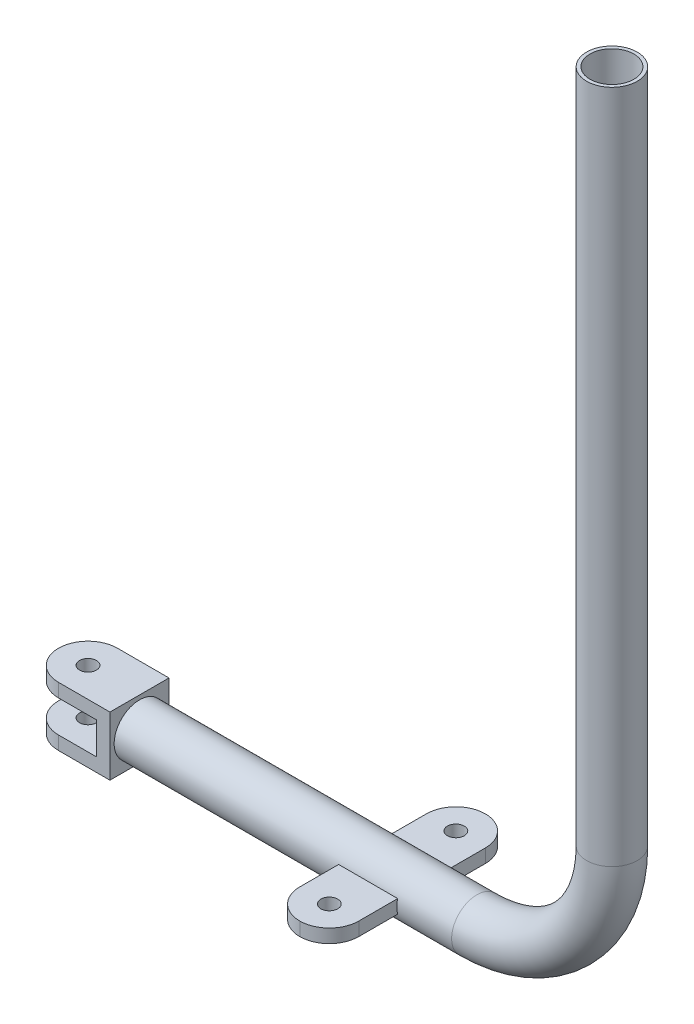
ISO-10303-21;
HEADER;
FILE_DESCRIPTION(('STEP AP214'),'2;1');
FILE_NAME('part.step','',(''),(''),'','','');
FILE_SCHEMA(('AUTOMOTIVE_DESIGN { 1 0 10303 214 1 1 1 1 }'));
ENDSEC;
DATA;
#1=APPLICATION_CONTEXT('core data for automotive mechanical design processes');
#2=APPLICATION_PROTOCOL_DEFINITION('international standard','automotive_design',2000,#1);
#3=PRODUCT_CONTEXT('',#1,'mechanical');
#4=PRODUCT('Part','Part','',(#3));
#5=PRODUCT_RELATED_PRODUCT_CATEGORY('part','',(#4));
#6=PRODUCT_DEFINITION_FORMATION('','',#4);
#7=PRODUCT_DEFINITION_CONTEXT('part definition',#1,'design');
#8=PRODUCT_DEFINITION('design','',#6,#7);
#9=PRODUCT_DEFINITION_SHAPE('','',#8);
#10=(LENGTH_UNIT() NAMED_UNIT(*) SI_UNIT(.MILLI.,.METRE.));
#11=(NAMED_UNIT(*) PLANE_ANGLE_UNIT() SI_UNIT($,.RADIAN.));
#12=(NAMED_UNIT(*) SI_UNIT($,.STERADIAN.) SOLID_ANGLE_UNIT());
#13=UNCERTAINTY_MEASURE_WITH_UNIT(LENGTH_MEASURE(1.E-05),#10,'distance_accuracy_value','');
#14=(GEOMETRIC_REPRESENTATION_CONTEXT(3) GLOBAL_UNCERTAINTY_ASSIGNED_CONTEXT((#13)) GLOBAL_UNIT_ASSIGNED_CONTEXT((#10,
#11,#12)) REPRESENTATION_CONTEXT('',''));
#15=CARTESIAN_POINT('',(0.,0.,0.));
#16=DIRECTION('',(0.,0.,1.));
#17=DIRECTION('',(1.,0.,0.));
#18=AXIS2_PLACEMENT_3D('',#15,#16,#17);
#19=CARTESIAN_POINT('',(0.,0.,0.));
#20=DIRECTION('',(1.,0.,0.));
#21=DIRECTION('',(0.,0.,-1.));
#22=AXIS2_PLACEMENT_3D('',#19,#20,#21);
#23=CYLINDRICAL_SURFACE('',#22,15.);
#24=DIRECTION('',(1.,0.,0.));
#25=VECTOR('',#24,1.);
#26=CARTESIAN_POINT('',(0.,-4.,-14.456832294801));
#27=LINE('',#26,#25);
#28=CARTESIAN_POINT('',(132.5,-3.99999999999999,-14.456832294801));
#29=VERTEX_POINT('',#28);
#30=CARTESIAN_POINT('',(167.5,-3.99999999999999,-14.456832294801));
#31=VERTEX_POINT('',#30);
#32=EDGE_CURVE('E224',#29,#31,#27,.T.);
#33=ORIENTED_EDGE('',*,*,#32,.T.);
#34=CARTESIAN_POINT('',(167.5,0.,0.));
#35=DIRECTION('',(1.,0.,0.));
#36=DIRECTION('',(0.,0.,-1.));
#37=AXIS2_PLACEMENT_3D('',#34,#35,#36);
#38=CIRCLE('',#37,15.);
#39=CARTESIAN_POINT('',(167.5,4.00000000000001,-14.456832294801));
#40=VERTEX_POINT('',#39);
#41=EDGE_CURVE('E208',#31,#40,#38,.T.);
#42=ORIENTED_EDGE('',*,*,#41,.T.);
#43=DIRECTION('',(1.,0.,0.));
#44=VECTOR('',#43,1.);
#45=CARTESIAN_POINT('',(0.,4.00000000000001,-14.456832294801));
#46=LINE('',#45,#44);
#47=CARTESIAN_POINT('',(132.5,4.00000000000001,-14.456832294801));
#48=VERTEX_POINT('',#47);
#49=EDGE_CURVE('E213',#40,#48,#46,.F.);
#50=ORIENTED_EDGE('',*,*,#49,.T.);
#51=CARTESIAN_POINT('',(132.5,0.,0.));
#52=DIRECTION('',(-1.,0.,0.));
#53=DIRECTION('',(0.,0.,1.));
#54=AXIS2_PLACEMENT_3D('',#51,#52,#53);
#55=CIRCLE('',#54,15.);
#56=EDGE_CURVE('E219',#48,#29,#55,.T.);
#57=ORIENTED_EDGE('',*,*,#56,.T.);
#58=EDGE_LOOP('',(#33,#42,#50,#57));
#59=FACE_BOUND('',#58,.T.);
#60=CARTESIAN_POINT('',(0.,0.,0.));
#61=DIRECTION('',(-1.,0.,0.));
#62=DIRECTION('',(0.,0.,-1.));
#63=AXIS2_PLACEMENT_3D('',#60,#61,#62);
#64=CIRCLE('',#63,15.);
#65=CARTESIAN_POINT('',(0.,0.,-15.));
#66=VERTEX_POINT('',#65);
#67=EDGE_CURVE('E321',#66,#66,#64,.T.);
#68=ORIENTED_EDGE('',*,*,#67,.F.);
#69=EDGE_LOOP('',(#68));
#70=FACE_BOUND('',#69,.T.);
#71=CARTESIAN_POINT('',(200.,0.,0.));
#72=DIRECTION('',(-1.,0.,0.));
#73=DIRECTION('',(0.,0.,-1.));
#74=AXIS2_PLACEMENT_3D('',#71,#72,#73);
#75=CIRCLE('',#74,15.);
#76=CARTESIAN_POINT('',(200.,-15.,0.));
#77=VERTEX_POINT('',#76);
#78=EDGE_CURVE('E324',#77,#77,#75,.T.);
#79=ORIENTED_EDGE('',*,*,#78,.T.);
#80=EDGE_LOOP('',(#79));
#81=FACE_BOUND('',#80,.T.);
#82=CARTESIAN_POINT('',(167.5,0.,0.));
#83=DIRECTION('',(-1.,0.,0.));
#84=DIRECTION('',(0.,0.,1.));
#85=AXIS2_PLACEMENT_3D('',#82,#83,#84);
#86=CIRCLE('',#85,15.);
#87=CARTESIAN_POINT('',(167.5,-3.99999999999999,14.456832294801));
#88=VERTEX_POINT('',#87);
#89=CARTESIAN_POINT('',(167.5,4.00000000000001,14.456832294801));
#90=VERTEX_POINT('',#89);
#91=EDGE_CURVE('E254',#88,#90,#86,.T.);
#92=ORIENTED_EDGE('',*,*,#91,.F.);
#93=DIRECTION('',(1.,0.,0.));
#94=VECTOR('',#93,1.);
#95=CARTESIAN_POINT('',(0.,-4.,14.456832294801));
#96=LINE('',#95,#94);
#97=CARTESIAN_POINT('',(132.5,-4.,14.456832294801));
#98=VERTEX_POINT('',#97);
#99=EDGE_CURVE('E245',#98,#88,#96,.T.);
#100=ORIENTED_EDGE('',*,*,#99,.F.);
#101=CARTESIAN_POINT('',(132.5,0.,0.));
#102=DIRECTION('',(1.,0.,0.));
#103=DIRECTION('',(0.,0.,-1.));
#104=AXIS2_PLACEMENT_3D('',#101,#102,#103);
#105=CIRCLE('',#104,15.);
#106=CARTESIAN_POINT('',(132.5,4.00000000000001,14.456832294801));
#107=VERTEX_POINT('',#106);
#108=EDGE_CURVE('E248',#107,#98,#105,.T.);
#109=ORIENTED_EDGE('',*,*,#108,.F.);
#110=DIRECTION('',(1.,0.,0.));
#111=VECTOR('',#110,1.);
#112=CARTESIAN_POINT('',(0.,4.00000000000001,14.456832294801));
#113=LINE('',#112,#111);
#114=EDGE_CURVE('E251',#90,#107,#113,.F.);
#115=ORIENTED_EDGE('',*,*,#114,.F.);
#116=EDGE_LOOP('',(#92,#100,#109,#115));
#117=FACE_BOUND('',#116,.T.);
#118=ADVANCED_FACE('F45',(#59,#70,#81,#117),#23,.T.);
#119=CARTESIAN_POINT('',(0.,0.,0.));
#120=DIRECTION('',(1.,0.,0.));
#121=DIRECTION('',(0.,0.,-1.));
#122=AXIS2_PLACEMENT_3D('',#119,#120,#121);
#123=CYLINDRICAL_SURFACE('',#122,13.);
#124=CARTESIAN_POINT('',(167.5,0.,0.));
#125=DIRECTION('',(1.,0.,0.));
#126=DIRECTION('',(0.,0.,-1.));
#127=AXIS2_PLACEMENT_3D('',#124,#125,#126);
#128=CIRCLE('',#127,13.);
#129=CARTESIAN_POINT('',(167.5,-4.,-12.369316876853));
#130=VERTEX_POINT('',#129);
#131=CARTESIAN_POINT('',(167.5,4.00000000000001,-12.369316876853));
#132=VERTEX_POINT('',#131);
#133=EDGE_CURVE('E404',#130,#132,#128,.T.);
#134=ORIENTED_EDGE('',*,*,#133,.F.);
#135=DIRECTION('',(1.,0.,0.));
#136=VECTOR('',#135,1.);
#137=CARTESIAN_POINT('',(0.,-4.,-12.369316876853));
#138=LINE('',#137,#136);
#139=CARTESIAN_POINT('',(132.5,-3.99999999999999,-12.369316876853));
#140=VERTEX_POINT('',#139);
#141=EDGE_CURVE('E401',#140,#130,#138,.T.);
#142=ORIENTED_EDGE('',*,*,#141,.F.);
#143=CARTESIAN_POINT('',(132.5,0.,0.));
#144=DIRECTION('',(-1.,0.,0.));
#145=DIRECTION('',(0.,0.,1.));
#146=AXIS2_PLACEMENT_3D('',#143,#144,#145);
#147=CIRCLE('',#146,13.);
#148=CARTESIAN_POINT('',(132.5,4.00000000000001,-12.369316876853));
#149=VERTEX_POINT('',#148);
#150=EDGE_CURVE('E398',#149,#140,#147,.T.);
#151=ORIENTED_EDGE('',*,*,#150,.F.);
#152=DIRECTION('',(1.,0.,0.));
#153=VECTOR('',#152,1.);
#154=CARTESIAN_POINT('',(0.,4.00000000000001,-12.369316876853));
#155=LINE('',#154,#153);
#156=EDGE_CURVE('E390',#132,#149,#155,.F.);
#157=ORIENTED_EDGE('',*,*,#156,.F.);
#158=EDGE_LOOP('',(#134,#142,#151,#157));
#159=FACE_BOUND('',#158,.T.);
#160=CARTESIAN_POINT('',(200.,0.,0.));
#161=DIRECTION('',(1.,0.,0.));
#162=DIRECTION('',(0.,0.,-1.));
#163=AXIS2_PLACEMENT_3D('',#160,#161,#162);
#164=CIRCLE('',#163,13.);
#165=CARTESIAN_POINT('',(200.,-13.,0.));
#166=VERTEX_POINT('',#165);
#167=EDGE_CURVE('E310',#166,#166,#164,.F.);
#168=ORIENTED_EDGE('',*,*,#167,.F.);
#169=EDGE_LOOP('',(#168));
#170=FACE_BOUND('',#169,.T.);
#171=CARTESIAN_POINT('',(0.,0.,0.));
#172=DIRECTION('',(-1.,0.,0.));
#173=DIRECTION('',(0.,0.,1.));
#174=AXIS2_PLACEMENT_3D('',#171,#172,#173);
#175=CIRCLE('',#174,13.);
#176=CARTESIAN_POINT('',(0.,0.,13.));
#177=VERTEX_POINT('',#176);
#178=EDGE_CURVE('E309',#177,#177,#175,.T.);
#179=ORIENTED_EDGE('',*,*,#178,.T.);
#180=EDGE_LOOP('',(#179));
#181=FACE_BOUND('',#180,.T.);
#182=DIRECTION('',(1.,0.,0.));
#183=VECTOR('',#182,1.);
#184=CARTESIAN_POINT('',(0.,-4.,12.369316876853));
#185=LINE('',#184,#183);
#186=CARTESIAN_POINT('',(132.5,-3.99999999999999,12.369316876853));
#187=VERTEX_POINT('',#186);
#188=CARTESIAN_POINT('',(167.5,-4.,12.369316876853));
#189=VERTEX_POINT('',#188);
#190=EDGE_CURVE('E359',#187,#189,#185,.T.);
#191=ORIENTED_EDGE('',*,*,#190,.T.);
#192=CARTESIAN_POINT('',(167.5,0.,0.));
#193=DIRECTION('',(-1.,0.,0.));
#194=DIRECTION('',(0.,0.,1.));
#195=AXIS2_PLACEMENT_3D('',#192,#193,#194);
#196=CIRCLE('',#195,13.);
#197=CARTESIAN_POINT('',(167.5,4.00000000000001,12.369316876853));
#198=VERTEX_POINT('',#197);
#199=EDGE_CURVE('E374',#189,#198,#196,.T.);
#200=ORIENTED_EDGE('',*,*,#199,.T.);
#201=DIRECTION('',(1.,0.,0.));
#202=VECTOR('',#201,1.);
#203=CARTESIAN_POINT('',(0.,4.00000000000001,12.369316876853));
#204=LINE('',#203,#202);
#205=CARTESIAN_POINT('',(132.5,4.00000000000001,12.369316876853));
#206=VERTEX_POINT('',#205);
#207=EDGE_CURVE('E371',#198,#206,#204,.F.);
#208=ORIENTED_EDGE('',*,*,#207,.T.);
#209=CARTESIAN_POINT('',(132.5,0.,0.));
#210=DIRECTION('',(1.,0.,0.));
#211=DIRECTION('',(0.,0.,-1.));
#212=AXIS2_PLACEMENT_3D('',#209,#210,#211);
#213=CIRCLE('',#212,13.);
#214=EDGE_CURVE('E368',#206,#187,#213,.T.);
#215=ORIENTED_EDGE('',*,*,#214,.T.);
#216=EDGE_LOOP('',(#191,#200,#208,#215));
#217=FACE_BOUND('',#216,.T.);
#218=ADVANCED_FACE('F451',(#159,#170,#181,#217),#123,.F.);
#219=CARTESIAN_POINT('',(-8.,0.,0.));
#220=DIRECTION('',(1.,0.,0.));
#221=DIRECTION('',(0.,0.,-1.));
#222=AXIS2_PLACEMENT_3D('',#219,#220,#221);
#223=PLANE('',#222);
#224=DIRECTION('',(0.,0.,-1.));
#225=VECTOR('',#224,1.);
#226=CARTESIAN_POINT('',(-8.,-9.50000000000001,17.5));
#227=LINE('',#226,#225);
#228=CARTESIAN_POINT('',(-8.,-9.50000000000001,17.5));
#229=VERTEX_POINT('',#228);
#230=CARTESIAN_POINT('',(-8.,-9.5,-17.5));
#231=VERTEX_POINT('',#230);
#232=EDGE_CURVE('E268',#229,#231,#227,.T.);
#233=ORIENTED_EDGE('',*,*,#232,.F.);
#234=DIRECTION('',(0.,1.,0.));
#235=VECTOR('',#234,1.);
#236=CARTESIAN_POINT('',(-8.,-17.5,17.5));
#237=LINE('',#236,#235);
#238=CARTESIAN_POINT('',(-8.,9.50000000000001,17.5));
#239=VERTEX_POINT('',#238);
#240=EDGE_CURVE('E284',#229,#239,#237,.T.);
#241=ORIENTED_EDGE('',*,*,#240,.T.);
#242=DIRECTION('',(0.,0.,1.));
#243=VECTOR('',#242,1.);
#244=CARTESIAN_POINT('',(-8.,9.50000000000001,17.5));
#245=LINE('',#244,#243);
#246=CARTESIAN_POINT('',(-8.,9.50000000000001,-17.5));
#247=VERTEX_POINT('',#246);
#248=EDGE_CURVE('E276',#247,#239,#245,.T.);
#249=ORIENTED_EDGE('',*,*,#248,.F.);
#250=DIRECTION('',(0.,-1.,0.));
#251=VECTOR('',#250,1.);
#252=CARTESIAN_POINT('',(-8.,-17.5,-17.5));
#253=LINE('',#252,#251);
#254=EDGE_CURVE('E287',#247,#231,#253,.T.);
#255=ORIENTED_EDGE('',*,*,#254,.T.);
#256=EDGE_LOOP('',(#233,#241,#249,#255));
#257=FACE_BOUND('',#256,.T.);
#258=ADVANCED_FACE('F456',(#257),#223,.F.);
#259=CARTESIAN_POINT('',(280.,480.,0.));
#260=DIRECTION('',(0.,-1.,0.));
#261=DIRECTION('',(0.,0.,-1.));
#262=AXIS2_PLACEMENT_3D('',#259,#260,#261);
#263=PLANE('',#262);
#264=CARTESIAN_POINT('',(280.,480.,0.));
#265=DIRECTION('',(0.,-1.,0.));
#266=DIRECTION('',(0.,0.,-1.));
#267=AXIS2_PLACEMENT_3D('',#264,#265,#266);
#268=CIRCLE('',#267,13.);
#269=CARTESIAN_POINT('',(280.,480.,-13.));
#270=VERTEX_POINT('',#269);
#271=EDGE_CURVE('E316',#270,#270,#268,.T.);
#272=ORIENTED_EDGE('',*,*,#271,.T.);
#273=EDGE_LOOP('',(#272));
#274=FACE_BOUND('',#273,.T.);
#275=CARTESIAN_POINT('',(280.,480.,0.));
#276=DIRECTION('',(0.,-1.,0.));
#277=DIRECTION('',(0.,0.,-1.));
#278=AXIS2_PLACEMENT_3D('',#275,#276,#277);
#279=CIRCLE('',#278,15.);
#280=CARTESIAN_POINT('',(280.,480.,-15.));
#281=VERTEX_POINT('',#280);
#282=EDGE_CURVE('E330',#281,#281,#279,.T.);
#283=ORIENTED_EDGE('',*,*,#282,.F.);
#284=EDGE_LOOP('',(#283));
#285=FACE_BOUND('',#284,.T.);
#286=ADVANCED_FACE('F467',(#274,#285),#263,.F.);
#287=CARTESIAN_POINT('',(200.,80.,0.));
#288=DIRECTION('',(0.,0.,1.));
#289=DIRECTION('',(1.,0.,0.));
#290=AXIS2_PLACEMENT_3D('',#287,#288,#289);
#291=TOROIDAL_SURFACE('',#290,80.,15.);
#292=CARTESIAN_POINT('',(280.,80.,0.));
#293=DIRECTION('',(0.,-1.,0.));
#294=DIRECTION('',(0.,0.,-1.));
#295=AXIS2_PLACEMENT_3D('',#292,#293,#294);
#296=CIRCLE('',#295,15.);
#297=CARTESIAN_POINT('',(295.,80.,0.));
#298=VERTEX_POINT('',#297);
#299=EDGE_CURVE('E327',#298,#298,#296,.T.);
#300=CARTESIAN_POINT('',(200.,80.,0.));
#301=DIRECTION('',(0.,0.,1.));
#302=DIRECTION('',(1.,0.,0.));
#303=AXIS2_PLACEMENT_3D('',#300,#301,#302);
#304=CIRCLE('',#303,95.);
#305=EDGE_CURVE('',#77,#298,#304,.T.);
#306=ORIENTED_EDGE('',*,*,#78,.F.);
#307=ORIENTED_EDGE('',*,*,#299,.T.);
#308=ORIENTED_EDGE('',*,*,#305,.T.);
#309=ORIENTED_EDGE('',*,*,#305,.F.);
#310=EDGE_LOOP('',(#306,#308,#307,#309));
#311=FACE_BOUND('',#310,.T.);
#312=ADVANCED_FACE('F463',(#311),#291,.T.);
#313=CARTESIAN_POINT('',(280.,80.,0.));
#314=DIRECTION('',(0.,1.,0.));
#315=DIRECTION('',(0.,0.,1.));
#316=AXIS2_PLACEMENT_3D('',#313,#314,#315);
#317=CYLINDRICAL_SURFACE('',#316,15.);
#318=ORIENTED_EDGE('',*,*,#282,.T.);
#319=EDGE_LOOP('',(#318));
#320=FACE_BOUND('',#319,.T.);
#321=ORIENTED_EDGE('',*,*,#299,.F.);
#322=EDGE_LOOP('',(#321));
#323=FACE_BOUND('',#322,.T.);
#324=ADVANCED_FACE('F466',(#320,#323),#317,.T.);
#325=CARTESIAN_POINT('',(200.,80.,0.));
#326=DIRECTION('',(0.,0.,1.));
#327=DIRECTION('',(1.,0.,0.));
#328=AXIS2_PLACEMENT_3D('',#325,#326,#327);
#329=TOROIDAL_SURFACE('',#328,80.,13.);
#330=CARTESIAN_POINT('',(280.,80.,0.));
#331=DIRECTION('',(0.,-1.,0.));
#332=DIRECTION('',(1.,0.,0.));
#333=AXIS2_PLACEMENT_3D('',#330,#331,#332);
#334=CIRCLE('',#333,13.);
#335=CARTESIAN_POINT('',(293.,80.,0.));
#336=VERTEX_POINT('',#335);
#337=EDGE_CURVE('E313',#336,#336,#334,.T.);
#338=CARTESIAN_POINT('',(200.,80.,0.));
#339=DIRECTION('',(0.,0.,1.));
#340=DIRECTION('',(1.,0.,0.));
#341=AXIS2_PLACEMENT_3D('',#338,#339,#340);
#342=CIRCLE('',#341,93.);
#343=EDGE_CURVE('',#166,#336,#342,.T.);
#344=ORIENTED_EDGE('',*,*,#167,.T.);
#345=ORIENTED_EDGE('',*,*,#337,.F.);
#346=ORIENTED_EDGE('',*,*,#343,.T.);
#347=ORIENTED_EDGE('',*,*,#343,.F.);
#348=EDGE_LOOP('',(#344,#346,#345,#347));
#349=FACE_BOUND('',#348,.T.);
#350=ADVANCED_FACE('F471',(#349),#329,.F.);
#351=CARTESIAN_POINT('',(280.,80.,0.));
#352=DIRECTION('',(0.,1.,0.));
#353=DIRECTION('',(0.,0.,1.));
#354=AXIS2_PLACEMENT_3D('',#351,#352,#353);
#355=CYLINDRICAL_SURFACE('',#354,13.);
#356=ORIENTED_EDGE('',*,*,#271,.F.);
#357=EDGE_LOOP('',(#356));
#358=FACE_BOUND('',#357,.T.);
#359=ORIENTED_EDGE('',*,*,#337,.T.);
#360=EDGE_LOOP('',(#359));
#361=FACE_BOUND('',#360,.T.);
#362=ADVANCED_FACE('F461',(#358,#361),#355,.F.);
#363=CARTESIAN_POINT('',(0.,0.,0.));
#364=DIRECTION('',(1.,0.,0.));
#365=DIRECTION('',(0.,0.,-1.));
#366=AXIS2_PLACEMENT_3D('',#363,#364,#365);
#367=PLANE('',#366);
#368=ORIENTED_EDGE('',*,*,#67,.T.);
#369=EDGE_LOOP('',(#368));
#370=FACE_BOUND('',#369,.T.);
#371=DIRECTION('',(0.,1.,0.));
#372=VECTOR('',#371,1.);
#373=CARTESIAN_POINT('',(0.,-17.5,17.5));
#374=LINE('',#373,#372);
#375=CARTESIAN_POINT('',(0.,-17.5,17.5));
#376=VERTEX_POINT('',#375);
#377=CARTESIAN_POINT('',(0.,17.5,17.5));
#378=VERTEX_POINT('',#377);
#379=EDGE_CURVE('E283',#376,#378,#374,.T.);
#380=ORIENTED_EDGE('',*,*,#379,.F.);
#381=DIRECTION('',(0.,0.,1.));
#382=VECTOR('',#381,1.);
#383=CARTESIAN_POINT('',(0.,-17.5,-17.5));
#384=LINE('',#383,#382);
#385=CARTESIAN_POINT('',(0.,-17.5,-17.5));
#386=VERTEX_POINT('',#385);
#387=EDGE_CURVE('E288',#386,#376,#384,.T.);
#388=ORIENTED_EDGE('',*,*,#387,.F.);
#389=DIRECTION('',(0.,-1.,0.));
#390=VECTOR('',#389,1.);
#391=CARTESIAN_POINT('',(0.,-17.5,-17.5));
#392=LINE('',#391,#390);
#393=CARTESIAN_POINT('',(0.,17.5,-17.5));
#394=VERTEX_POINT('',#393);
#395=EDGE_CURVE('E297',#394,#386,#392,.T.);
#396=ORIENTED_EDGE('',*,*,#395,.F.);
#397=DIRECTION('',(0.,0.,-1.));
#398=VECTOR('',#397,1.);
#399=CARTESIAN_POINT('',(0.,17.5,-17.5));
#400=LINE('',#399,#398);
#401=EDGE_CURVE('E294',#378,#394,#400,.T.);
#402=ORIENTED_EDGE('',*,*,#401,.F.);
#403=EDGE_LOOP('',(#380,#388,#396,#402));
#404=FACE_BOUND('',#403,.T.);
#405=ADVANCED_FACE('F571',(#370,#404),#367,.T.);
#406=CARTESIAN_POINT('',(-8.,-17.5,-17.5));
#407=DIRECTION('',(0.,1.,0.));
#408=DIRECTION('',(0.,0.,1.));
#409=AXIS2_PLACEMENT_3D('',#406,#407,#408);
#410=PLANE('',#409);
#411=CARTESIAN_POINT('',(-30.5,-17.5,0.));
#412=DIRECTION('',(0.,1.,0.));
#413=DIRECTION('',(0.,0.,1.));
#414=AXIS2_PLACEMENT_3D('',#411,#412,#413);
#415=CIRCLE('',#414,5.);
#416=CARTESIAN_POINT('',(-30.5,-17.5,5.));
#417=VERTEX_POINT('',#416);
#418=EDGE_CURVE('E258',#417,#417,#415,.T.);
#419=ORIENTED_EDGE('',*,*,#418,.T.);
#420=EDGE_LOOP('',(#419));
#421=FACE_BOUND('',#420,.T.);
#422=DIRECTION('',(1.,0.,0.));
#423=VECTOR('',#422,1.);
#424=CARTESIAN_POINT('',(-8.,-17.5,17.5));
#425=LINE('',#424,#423);
#426=CARTESIAN_POINT('',(-30.5,-17.5,17.5));
#427=VERTEX_POINT('',#426);
#428=EDGE_CURVE('E291',#427,#376,#425,.T.);
#429=ORIENTED_EDGE('',*,*,#428,.F.);
#430=CARTESIAN_POINT('',(-30.5,-17.5,0.));
#431=DIRECTION('',(0.,1.,0.));
#432=DIRECTION('',(0.,0.,1.));
#433=AXIS2_PLACEMENT_3D('',#430,#431,#432);
#434=CIRCLE('',#433,17.5);
#435=CARTESIAN_POINT('',(-48.,-17.5,0.));
#436=VERTEX_POINT('',#435);
#437=EDGE_CURVE('E345',#427,#436,#434,.F.);
#438=ORIENTED_EDGE('',*,*,#437,.T.);
#439=CARTESIAN_POINT('',(-30.5,-17.5,0.));
#440=DIRECTION('',(0.,1.,0.));
#441=DIRECTION('',(0.,0.,1.));
#442=AXIS2_PLACEMENT_3D('',#439,#440,#441);
#443=CIRCLE('',#442,17.5);
#444=CARTESIAN_POINT('',(-30.5,-17.5,-17.5));
#445=VERTEX_POINT('',#444);
#446=EDGE_CURVE('E343',#436,#445,#443,.F.);
#447=ORIENTED_EDGE('',*,*,#446,.T.);
#448=DIRECTION('',(1.,0.,0.));
#449=VECTOR('',#448,1.);
#450=CARTESIAN_POINT('',(-8.,-17.5,-17.5));
#451=LINE('',#450,#449);
#452=EDGE_CURVE('E303',#445,#386,#451,.T.);
#453=ORIENTED_EDGE('',*,*,#452,.T.);
#454=ORIENTED_EDGE('',*,*,#387,.T.);
#455=EDGE_LOOP('',(#429,#438,#447,#453,#454));
#456=FACE_BOUND('',#455,.T.);
#457=ADVANCED_FACE('F584',(#421,#456),#410,.F.);
#458=CARTESIAN_POINT('',(-8.,-17.5,-17.5));
#459=DIRECTION('',(0.,0.,1.));
#460=DIRECTION('',(1.,0.,0.));
#461=AXIS2_PLACEMENT_3D('',#458,#459,#460);
#462=PLANE('',#461);
#463=ORIENTED_EDGE('',*,*,#452,.F.);
#464=DIRECTION('',(0.,-1.,0.));
#465=VECTOR('',#464,1.);
#466=CARTESIAN_POINT('',(-30.5,-9.5,-17.5));
#467=LINE('',#466,#465);
#468=CARTESIAN_POINT('',(-30.5,-9.5,-17.5));
#469=VERTEX_POINT('',#468);
#470=EDGE_CURVE('E349',#445,#469,#467,.F.);
#471=ORIENTED_EDGE('',*,*,#470,.T.);
#472=DIRECTION('',(1.,0.,0.));
#473=VECTOR('',#472,1.);
#474=CARTESIAN_POINT('',(-48.,-9.5,-17.5));
#475=LINE('',#474,#473);
#476=EDGE_CURVE('E271',#469,#231,#475,.T.);
#477=ORIENTED_EDGE('',*,*,#476,.T.);
#478=ORIENTED_EDGE('',*,*,#254,.F.);
#479=DIRECTION('',(1.,0.,0.));
#480=VECTOR('',#479,1.);
#481=CARTESIAN_POINT('',(-48.,9.5,-17.5));
#482=LINE('',#481,#480);
#483=CARTESIAN_POINT('',(-30.5,9.5,-17.5));
#484=VERTEX_POINT('',#483);
#485=EDGE_CURVE('E281',#484,#247,#482,.T.);
#486=ORIENTED_EDGE('',*,*,#485,.F.);
#487=DIRECTION('',(0.,-1.,0.));
#488=VECTOR('',#487,1.);
#489=CARTESIAN_POINT('',(-30.5,-17.5,-17.5));
#490=LINE('',#489,#488);
#491=CARTESIAN_POINT('',(-30.5,17.5,-17.5));
#492=VERTEX_POINT('',#491);
#493=EDGE_CURVE('E347',#484,#492,#490,.F.);
#494=ORIENTED_EDGE('',*,*,#493,.T.);
#495=DIRECTION('',(1.,0.,0.));
#496=VECTOR('',#495,1.);
#497=CARTESIAN_POINT('',(-8.,17.5,-17.5));
#498=LINE('',#497,#496);
#499=EDGE_CURVE('E305',#492,#394,#498,.T.);
#500=ORIENTED_EDGE('',*,*,#499,.T.);
#501=ORIENTED_EDGE('',*,*,#395,.T.);
#502=EDGE_LOOP('',(#463,#471,#477,#478,#486,#494,#500,#501));
#503=FACE_BOUND('',#502,.T.);
#504=ADVANCED_FACE('F590',(#503),#462,.F.);
#505=CARTESIAN_POINT('',(-8.,17.5,-17.5));
#506=DIRECTION('',(0.,-1.,0.));
#507=DIRECTION('',(0.,0.,-1.));
#508=AXIS2_PLACEMENT_3D('',#505,#506,#507);
#509=PLANE('',#508);
#510=CARTESIAN_POINT('',(-30.5,17.5,0.));
#511=DIRECTION('',(0.,1.,0.));
#512=DIRECTION('',(0.,0.,1.));
#513=AXIS2_PLACEMENT_3D('',#510,#511,#512);
#514=CIRCLE('',#513,5.);
#515=CARTESIAN_POINT('',(-30.5,17.5,5.));
#516=VERTEX_POINT('',#515);
#517=EDGE_CURVE('E257',#516,#516,#514,.T.);
#518=ORIENTED_EDGE('',*,*,#517,.F.);
#519=EDGE_LOOP('',(#518));
#520=FACE_BOUND('',#519,.T.);
#521=CARTESIAN_POINT('',(-30.5,17.5,0.));
#522=DIRECTION('',(0.,-1.,0.));
#523=DIRECTION('',(0.,0.,-1.));
#524=AXIS2_PLACEMENT_3D('',#521,#522,#523);
#525=CIRCLE('',#524,17.5);
#526=CARTESIAN_POINT('',(-48.,17.5,0.));
#527=VERTEX_POINT('',#526);
#528=EDGE_CURVE('E351',#492,#527,#525,.F.);
#529=ORIENTED_EDGE('',*,*,#528,.T.);
#530=CARTESIAN_POINT('',(-30.5,17.5,0.));
#531=DIRECTION('',(0.,-1.,0.));
#532=DIRECTION('',(0.,0.,-1.));
#533=AXIS2_PLACEMENT_3D('',#530,#531,#532);
#534=CIRCLE('',#533,17.5);
#535=CARTESIAN_POINT('',(-30.5,17.5,17.5));
#536=VERTEX_POINT('',#535);
#537=EDGE_CURVE('E353',#527,#536,#534,.F.);
#538=ORIENTED_EDGE('',*,*,#537,.T.);
#539=DIRECTION('',(1.,0.,0.));
#540=VECTOR('',#539,1.);
#541=CARTESIAN_POINT('',(-8.,17.5,17.5));
#542=LINE('',#541,#540);
#543=EDGE_CURVE('E307',#536,#378,#542,.T.);
#544=ORIENTED_EDGE('',*,*,#543,.T.);
#545=ORIENTED_EDGE('',*,*,#401,.T.);
#546=ORIENTED_EDGE('',*,*,#499,.F.);
#547=EDGE_LOOP('',(#529,#538,#544,#545,#546));
#548=FACE_BOUND('',#547,.T.);
#549=ADVANCED_FACE('F578',(#520,#548),#509,.F.);
#550=CARTESIAN_POINT('',(-8.,-17.5,17.5));
#551=DIRECTION('',(0.,0.,-1.));
#552=DIRECTION('',(-1.,0.,0.));
#553=AXIS2_PLACEMENT_3D('',#550,#551,#552);
#554=PLANE('',#553);
#555=DIRECTION('',(1.,0.,0.));
#556=VECTOR('',#555,1.);
#557=CARTESIAN_POINT('',(-48.,-9.50000000000001,17.5));
#558=LINE('',#557,#556);
#559=CARTESIAN_POINT('',(-30.5,-9.50000000000001,17.5));
#560=VERTEX_POINT('',#559);
#561=EDGE_CURVE('E274',#560,#229,#558,.T.);
#562=ORIENTED_EDGE('',*,*,#561,.F.);
#563=DIRECTION('',(0.,1.,0.));
#564=VECTOR('',#563,1.);
#565=CARTESIAN_POINT('',(-30.5,-17.5,17.5));
#566=LINE('',#565,#564);
#567=EDGE_CURVE('E340',#560,#427,#566,.F.);
#568=ORIENTED_EDGE('',*,*,#567,.T.);
#569=ORIENTED_EDGE('',*,*,#428,.T.);
#570=ORIENTED_EDGE('',*,*,#379,.T.);
#571=ORIENTED_EDGE('',*,*,#543,.F.);
#572=DIRECTION('',(0.,1.,0.));
#573=VECTOR('',#572,1.);
#574=CARTESIAN_POINT('',(-30.5,-17.5,17.5));
#575=LINE('',#574,#573);
#576=CARTESIAN_POINT('',(-30.5,9.50000000000001,17.5));
#577=VERTEX_POINT('',#576);
#578=EDGE_CURVE('E337',#536,#577,#575,.F.);
#579=ORIENTED_EDGE('',*,*,#578,.T.);
#580=DIRECTION('',(1.,0.,0.));
#581=VECTOR('',#580,1.);
#582=CARTESIAN_POINT('',(-48.,9.50000000000001,17.5));
#583=LINE('',#582,#581);
#584=EDGE_CURVE('E279',#577,#239,#583,.T.);
#585=ORIENTED_EDGE('',*,*,#584,.T.);
#586=ORIENTED_EDGE('',*,*,#240,.F.);
#587=EDGE_LOOP('',(#562,#568,#569,#570,#571,#579,#585,#586));
#588=FACE_BOUND('',#587,.T.);
#589=ADVANCED_FACE('F569',(#588),#554,.F.);
#590=ORIENTED_EDGE('',*,*,#178,.F.);
#591=EDGE_LOOP('',(#590));
#592=FACE_BOUND('',#591,.T.);
#593=ADVANCED_FACE('F566',(#592),#367,.T.);
#594=CARTESIAN_POINT('',(-48.,9.50000000000001,17.5));
#595=DIRECTION('',(0.,1.,0.));
#596=DIRECTION('',(0.,0.,1.));
#597=AXIS2_PLACEMENT_3D('',#594,#595,#596);
#598=PLANE('',#597);
#599=CARTESIAN_POINT('',(-30.5,9.50000000000001,0.));
#600=DIRECTION('',(0.,1.,0.));
#601=DIRECTION('',(0.,0.,1.));
#602=AXIS2_PLACEMENT_3D('',#599,#600,#601);
#603=CIRCLE('',#602,5.);
#604=CARTESIAN_POINT('',(-30.5,9.50000000000001,5.));
#605=VERTEX_POINT('',#604);
#606=EDGE_CURVE('E264',#605,#605,#603,.T.);
#607=ORIENTED_EDGE('',*,*,#606,.T.);
#608=EDGE_LOOP('',(#607));
#609=FACE_BOUND('',#608,.T.);
#610=ORIENTED_EDGE('',*,*,#584,.F.);
#611=CARTESIAN_POINT('',(-30.5,9.5,0.));
#612=DIRECTION('',(0.,1.,0.));
#613=DIRECTION('',(0.,0.,1.));
#614=AXIS2_PLACEMENT_3D('',#611,#612,#613);
#615=CIRCLE('',#614,17.5);
#616=CARTESIAN_POINT('',(-48.,9.5,0.));
#617=VERTEX_POINT('',#616);
#618=EDGE_CURVE('E357',#577,#617,#615,.F.);
#619=ORIENTED_EDGE('',*,*,#618,.T.);
#620=CARTESIAN_POINT('',(-30.5,9.5,0.));
#621=DIRECTION('',(0.,1.,0.));
#622=DIRECTION('',(0.,0.,1.));
#623=AXIS2_PLACEMENT_3D('',#620,#621,#622);
#624=CIRCLE('',#623,17.5);
#625=EDGE_CURVE('E355',#617,#484,#624,.F.);
#626=ORIENTED_EDGE('',*,*,#625,.T.);
#627=ORIENTED_EDGE('',*,*,#485,.T.);
#628=ORIENTED_EDGE('',*,*,#248,.T.);
#629=EDGE_LOOP('',(#610,#619,#626,#627,#628));
#630=FACE_BOUND('',#629,.T.);
#631=ADVANCED_FACE('F568',(#609,#630),#598,.F.);
#632=CARTESIAN_POINT('',(-48.,-9.50000000000001,17.5));
#633=DIRECTION('',(0.,-1.,0.));
#634=DIRECTION('',(0.,0.,-1.));
#635=AXIS2_PLACEMENT_3D('',#632,#633,#634);
#636=PLANE('',#635);
#637=CARTESIAN_POINT('',(-30.5,-9.5,0.));
#638=DIRECTION('',(0.,-1.,0.));
#639=DIRECTION('',(0.,0.,-1.));
#640=AXIS2_PLACEMENT_3D('',#637,#638,#639);
#641=CIRCLE('',#640,5.);
#642=CARTESIAN_POINT('',(-30.5,-9.5,-5.));
#643=VERTEX_POINT('',#642);
#644=EDGE_CURVE('E261',#643,#643,#641,.T.);
#645=ORIENTED_EDGE('',*,*,#644,.T.);
#646=EDGE_LOOP('',(#645));
#647=FACE_BOUND('',#646,.T.);
#648=CARTESIAN_POINT('',(-30.5,-9.5,0.));
#649=DIRECTION('',(0.,-1.,0.));
#650=DIRECTION('',(0.,0.,-1.));
#651=AXIS2_PLACEMENT_3D('',#648,#649,#650);
#652=CIRCLE('',#651,17.5);
#653=CARTESIAN_POINT('',(-48.,-9.5,0.));
#654=VERTEX_POINT('',#653);
#655=EDGE_CURVE('E333',#469,#654,#652,.F.);
#656=ORIENTED_EDGE('',*,*,#655,.T.);
#657=CARTESIAN_POINT('',(-30.5,-9.5,0.));
#658=DIRECTION('',(0.,-1.,0.));
#659=DIRECTION('',(0.,0.,-1.));
#660=AXIS2_PLACEMENT_3D('',#657,#658,#659);
#661=CIRCLE('',#660,17.5);
#662=EDGE_CURVE('E335',#654,#560,#661,.F.);
#663=ORIENTED_EDGE('',*,*,#662,.T.);
#664=ORIENTED_EDGE('',*,*,#561,.T.);
#665=ORIENTED_EDGE('',*,*,#232,.T.);
#666=ORIENTED_EDGE('',*,*,#476,.F.);
#667=EDGE_LOOP('',(#656,#663,#664,#665,#666));
#668=FACE_BOUND('',#667,.T.);
#669=ADVANCED_FACE('F484',(#647,#668),#636,.F.);
#670=CARTESIAN_POINT('',(-30.5,0.,0.));
#671=DIRECTION('',(0.,1.,0.));
#672=DIRECTION('',(0.,0.,1.));
#673=AXIS2_PLACEMENT_3D('',#670,#671,#672);
#674=CYLINDRICAL_SURFACE('',#673,17.5);
#675=ORIENTED_EDGE('',*,*,#470,.F.);
#676=ORIENTED_EDGE('',*,*,#446,.F.);
#677=DIRECTION('',(0.,-1.,0.));
#678=VECTOR('',#677,1.);
#679=CARTESIAN_POINT('',(-48.,-17.5,0.));
#680=LINE('',#679,#678);
#681=EDGE_CURVE('E272',#654,#436,#680,.T.);
#682=ORIENTED_EDGE('',*,*,#681,.F.);
#683=ORIENTED_EDGE('',*,*,#655,.F.);
#684=EDGE_LOOP('',(#675,#676,#682,#683));
#685=FACE_BOUND('',#684,.T.);
#686=ADVANCED_FACE('F480',(#685),#674,.T.);
#687=CARTESIAN_POINT('',(-30.5,0.,0.));
#688=DIRECTION('',(0.,-1.,0.));
#689=DIRECTION('',(0.,0.,-1.));
#690=AXIS2_PLACEMENT_3D('',#687,#688,#689);
#691=CYLINDRICAL_SURFACE('',#690,17.5);
#692=ORIENTED_EDGE('',*,*,#437,.F.);
#693=ORIENTED_EDGE('',*,*,#567,.F.);
#694=ORIENTED_EDGE('',*,*,#662,.F.);
#695=ORIENTED_EDGE('',*,*,#681,.T.);
#696=EDGE_LOOP('',(#692,#693,#694,#695));
#697=FACE_BOUND('',#696,.T.);
#698=ADVANCED_FACE('F476',(#697),#691,.T.);
#699=CARTESIAN_POINT('',(-30.5,0.,0.));
#700=DIRECTION('',(0.,-1.,0.));
#701=DIRECTION('',(0.,0.,-1.));
#702=AXIS2_PLACEMENT_3D('',#699,#700,#701);
#703=CYLINDRICAL_SURFACE('',#702,17.5);
#704=ORIENTED_EDGE('',*,*,#493,.F.);
#705=ORIENTED_EDGE('',*,*,#625,.F.);
#706=DIRECTION('',(0.,-1.,0.));
#707=VECTOR('',#706,1.);
#708=CARTESIAN_POINT('',(-48.,0.,0.));
#709=LINE('',#708,#707);
#710=EDGE_CURVE('E267',#527,#617,#709,.T.);
#711=ORIENTED_EDGE('',*,*,#710,.F.);
#712=ORIENTED_EDGE('',*,*,#528,.F.);
#713=EDGE_LOOP('',(#704,#705,#711,#712));
#714=FACE_BOUND('',#713,.T.);
#715=ADVANCED_FACE('F479',(#714),#703,.T.);
#716=CARTESIAN_POINT('',(-30.5,0.,0.));
#717=DIRECTION('',(0.,1.,0.));
#718=DIRECTION('',(0.,0.,1.));
#719=AXIS2_PLACEMENT_3D('',#716,#717,#718);
#720=CYLINDRICAL_SURFACE('',#719,17.5);
#721=ORIENTED_EDGE('',*,*,#618,.F.);
#722=ORIENTED_EDGE('',*,*,#578,.F.);
#723=ORIENTED_EDGE('',*,*,#537,.F.);
#724=ORIENTED_EDGE('',*,*,#710,.T.);
#725=EDGE_LOOP('',(#721,#722,#723,#724));
#726=FACE_BOUND('',#725,.T.);
#727=ADVANCED_FACE('F486',(#726),#720,.T.);
#728=CARTESIAN_POINT('',(-30.5,-17.5,0.));
#729=DIRECTION('',(0.,1.,0.));
#730=DIRECTION('',(0.,0.,1.));
#731=AXIS2_PLACEMENT_3D('',#728,#729,#730);
#732=CYLINDRICAL_SURFACE('',#731,5.);
#733=ORIENTED_EDGE('',*,*,#418,.F.);
#734=EDGE_LOOP('',(#733));
#735=FACE_BOUND('',#734,.T.);
#736=ORIENTED_EDGE('',*,*,#644,.F.);
#737=EDGE_LOOP('',(#736));
#738=FACE_BOUND('',#737,.T.);
#739=ADVANCED_FACE('F489',(#735,#738),#732,.F.);
#740=ORIENTED_EDGE('',*,*,#517,.T.);
#741=EDGE_LOOP('',(#740));
#742=FACE_BOUND('',#741,.T.);
#743=ORIENTED_EDGE('',*,*,#606,.F.);
#744=EDGE_LOOP('',(#743));
#745=FACE_BOUND('',#744,.T.);
#746=ADVANCED_FACE('F648',(#742,#745),#732,.F.);
#747=CARTESIAN_POINT('',(132.5,-3.99999999999999,55.));
#748=DIRECTION('',(0.,1.,0.));
#749=DIRECTION('',(-1.,0.,0.));
#750=AXIS2_PLACEMENT_3D('',#747,#748,#749);
#751=PLANE('',#750);
#752=ORIENTED_EDGE('',*,*,#190,.F.);
#753=DIRECTION('',(0.,0.,-1.));
#754=VECTOR('',#753,1.);
#755=CARTESIAN_POINT('',(132.5,-3.99999999999999,55.));
#756=LINE('',#755,#754);
#757=EDGE_CURVE('E235',#187,#140,#756,.T.);
#758=ORIENTED_EDGE('',*,*,#757,.T.);
#759=ORIENTED_EDGE('',*,*,#141,.T.);
#760=DIRECTION('',(0.,0.,-1.));
#761=VECTOR('',#760,1.);
#762=CARTESIAN_POINT('',(167.5,-3.99999999999999,55.));
#763=LINE('',#762,#761);
#764=EDGE_CURVE('E236',#189,#130,#763,.T.);
#765=ORIENTED_EDGE('',*,*,#764,.F.);
#766=EDGE_LOOP('',(#752,#758,#759,#765));
#767=FACE_BOUND('',#766,.T.);
#768=ADVANCED_FACE('F541',(#767),#751,.F.);
#769=CARTESIAN_POINT('',(132.5,-3.99999999999999,55.));
#770=DIRECTION('',(1.,0.,0.));
#771=DIRECTION('',(0.,0.,-1.));
#772=AXIS2_PLACEMENT_3D('',#769,#770,#771);
#773=PLANE('',#772);
#774=ORIENTED_EDGE('',*,*,#214,.F.);
#775=DIRECTION('',(0.,0.,-1.));
#776=VECTOR('',#775,1.);
#777=CARTESIAN_POINT('',(132.5,4.00000000000001,55.));
#778=LINE('',#777,#776);
#779=EDGE_CURVE('E239',#206,#149,#778,.T.);
#780=ORIENTED_EDGE('',*,*,#779,.T.);
#781=ORIENTED_EDGE('',*,*,#150,.T.);
#782=ORIENTED_EDGE('',*,*,#757,.F.);
#783=EDGE_LOOP('',(#774,#780,#781,#782));
#784=FACE_BOUND('',#783,.T.);
#785=ADVANCED_FACE('F509',(#784),#773,.F.);
#786=CARTESIAN_POINT('',(132.5,4.00000000000001,55.));
#787=DIRECTION('',(0.,-1.,0.));
#788=DIRECTION('',(1.,0.,0.));
#789=AXIS2_PLACEMENT_3D('',#786,#787,#788);
#790=PLANE('',#789);
#791=ORIENTED_EDGE('',*,*,#207,.F.);
#792=DIRECTION('',(0.,0.,-1.));
#793=VECTOR('',#792,1.);
#794=CARTESIAN_POINT('',(167.5,4.00000000000001,55.));
#795=LINE('',#794,#793);
#796=EDGE_CURVE('E242',#198,#132,#795,.T.);
#797=ORIENTED_EDGE('',*,*,#796,.T.);
#798=ORIENTED_EDGE('',*,*,#156,.T.);
#799=ORIENTED_EDGE('',*,*,#779,.F.);
#800=EDGE_LOOP('',(#791,#797,#798,#799));
#801=FACE_BOUND('',#800,.T.);
#802=ADVANCED_FACE('F534',(#801),#790,.F.);
#803=CARTESIAN_POINT('',(167.5,-3.99999999999999,55.));
#804=DIRECTION('',(-1.,0.,0.));
#805=DIRECTION('',(0.,0.,1.));
#806=AXIS2_PLACEMENT_3D('',#803,#804,#805);
#807=PLANE('',#806);
#808=ORIENTED_EDGE('',*,*,#199,.F.);
#809=ORIENTED_EDGE('',*,*,#764,.T.);
#810=ORIENTED_EDGE('',*,*,#133,.T.);
#811=ORIENTED_EDGE('',*,*,#796,.F.);
#812=EDGE_LOOP('',(#808,#809,#810,#811));
#813=FACE_BOUND('',#812,.T.);
#814=ADVANCED_FACE('F531',(#813),#807,.F.);
#815=CARTESIAN_POINT('',(150.,4.00000000000001,37.5));
#816=DIRECTION('',(0.,1.,0.));
#817=DIRECTION('',(-1.,0.,0.));
#818=AXIS2_PLACEMENT_3D('',#815,#816,#817);
#819=CIRCLE('',#818,4.99999999999999);
#820=CARTESIAN_POINT('',(145.,4.00000000000001,37.5));
#821=VERTEX_POINT('',#820);
#822=EDGE_CURVE('E225',#821,#821,#819,.T.);
#823=ORIENTED_EDGE('',*,*,#822,.F.);
#824=EDGE_LOOP('',(#823));
#825=FACE_BOUND('',#824,.T.);
#826=CARTESIAN_POINT('',(132.5,4.00000000000001,37.5));
#827=VERTEX_POINT('',#826);
#828=EDGE_CURVE('E240',#827,#107,#778,.T.);
#829=ORIENTED_EDGE('',*,*,#828,.F.);
#830=CARTESIAN_POINT('',(150.,4.00000000000001,37.5));
#831=DIRECTION('',(0.,-1.,0.));
#832=DIRECTION('',(1.,0.,0.));
#833=AXIS2_PLACEMENT_3D('',#830,#831,#832);
#834=CIRCLE('',#833,17.5);
#835=CARTESIAN_POINT('',(150.,4.00000000000001,55.));
#836=VERTEX_POINT('',#835);
#837=EDGE_CURVE('E386',#827,#836,#834,.F.);
#838=ORIENTED_EDGE('',*,*,#837,.T.);
#839=CARTESIAN_POINT('',(150.,4.00000000000001,37.5));
#840=DIRECTION('',(0.,-1.,0.));
#841=DIRECTION('',(1.,0.,0.));
#842=AXIS2_PLACEMENT_3D('',#839,#840,#841);
#843=CIRCLE('',#842,17.5);
#844=CARTESIAN_POINT('',(167.5,4.00000000000001,37.5));
#845=VERTEX_POINT('',#844);
#846=EDGE_CURVE('E384',#836,#845,#843,.F.);
#847=ORIENTED_EDGE('',*,*,#846,.T.);
#848=EDGE_CURVE('E243',#845,#90,#795,.T.);
#849=ORIENTED_EDGE('',*,*,#848,.T.);
#850=ORIENTED_EDGE('',*,*,#114,.T.);
#851=EDGE_LOOP('',(#829,#838,#847,#849,#850));
#852=FACE_BOUND('',#851,.T.);
#853=ADVANCED_FACE('F528',(#825,#852),#790,.F.);
#854=CARTESIAN_POINT('',(150.,-3.99999999999999,37.5));
#855=DIRECTION('',(0.,1.,0.));
#856=DIRECTION('',(-1.,0.,0.));
#857=AXIS2_PLACEMENT_3D('',#854,#855,#856);
#858=CIRCLE('',#857,4.99999999999999);
#859=CARTESIAN_POINT('',(145.,-3.99999999999999,37.5));
#860=VERTEX_POINT('',#859);
#861=EDGE_CURVE('E228',#860,#860,#858,.T.);
#862=ORIENTED_EDGE('',*,*,#861,.T.);
#863=EDGE_LOOP('',(#862));
#864=FACE_BOUND('',#863,.T.);
#865=CARTESIAN_POINT('',(150.,-3.99999999999999,37.5));
#866=DIRECTION('',(0.,1.,0.));
#867=DIRECTION('',(-1.,0.,0.));
#868=AXIS2_PLACEMENT_3D('',#865,#866,#867);
#869=CIRCLE('',#868,17.5);
#870=CARTESIAN_POINT('',(167.5,-3.99999999999999,37.5));
#871=VERTEX_POINT('',#870);
#872=CARTESIAN_POINT('',(150.,-3.99999999999999,55.));
#873=VERTEX_POINT('',#872);
#874=EDGE_CURVE('E377',#871,#873,#869,.F.);
#875=ORIENTED_EDGE('',*,*,#874,.T.);
#876=CARTESIAN_POINT('',(150.,-3.99999999999999,37.5));
#877=DIRECTION('',(0.,1.,0.));
#878=DIRECTION('',(-1.,0.,0.));
#879=AXIS2_PLACEMENT_3D('',#876,#877,#878);
#880=CIRCLE('',#879,17.5);
#881=CARTESIAN_POINT('',(132.5,-3.99999999999999,37.5));
#882=VERTEX_POINT('',#881);
#883=EDGE_CURVE('E379',#873,#882,#880,.F.);
#884=ORIENTED_EDGE('',*,*,#883,.T.);
#885=EDGE_CURVE('E237',#882,#98,#756,.T.);
#886=ORIENTED_EDGE('',*,*,#885,.T.);
#887=ORIENTED_EDGE('',*,*,#99,.T.);
#888=EDGE_CURVE('E233',#871,#88,#763,.T.);
#889=ORIENTED_EDGE('',*,*,#888,.F.);
#890=EDGE_LOOP('',(#875,#884,#886,#887,#889));
#891=FACE_BOUND('',#890,.T.);
#892=ADVANCED_FACE('F519',(#864,#891),#751,.F.);
#893=ORIENTED_EDGE('',*,*,#848,.F.);
#894=DIRECTION('',(0.,1.,0.));
#895=VECTOR('',#894,1.);
#896=CARTESIAN_POINT('',(167.5,-3.99999999999999,37.5));
#897=LINE('',#896,#895);
#898=EDGE_CURVE('E388',#845,#871,#897,.F.);
#899=ORIENTED_EDGE('',*,*,#898,.T.);
#900=ORIENTED_EDGE('',*,*,#888,.T.);
#901=ORIENTED_EDGE('',*,*,#91,.T.);
#902=EDGE_LOOP('',(#893,#899,#900,#901));
#903=FACE_BOUND('',#902,.T.);
#904=ADVANCED_FACE('F506',(#903),#807,.F.);
#905=ORIENTED_EDGE('',*,*,#885,.F.);
#906=DIRECTION('',(0.,-1.,0.));
#907=VECTOR('',#906,1.);
#908=CARTESIAN_POINT('',(132.5,-3.99999999999999,37.5));
#909=LINE('',#908,#907);
#910=EDGE_CURVE('E381',#882,#827,#909,.F.);
#911=ORIENTED_EDGE('',*,*,#910,.T.);
#912=ORIENTED_EDGE('',*,*,#828,.T.);
#913=ORIENTED_EDGE('',*,*,#108,.T.);
#914=EDGE_LOOP('',(#905,#911,#912,#913));
#915=FACE_BOUND('',#914,.T.);
#916=ADVANCED_FACE('F501',(#915),#773,.F.);
#917=CARTESIAN_POINT('',(150.,0.,37.5));
#918=DIRECTION('',(0.,1.,0.));
#919=DIRECTION('',(0.,0.,1.));
#920=AXIS2_PLACEMENT_3D('',#917,#918,#919);
#921=CYLINDRICAL_SURFACE('',#920,17.5);
#922=ORIENTED_EDGE('',*,*,#898,.F.);
#923=ORIENTED_EDGE('',*,*,#846,.F.);
#924=DIRECTION('',(0.,1.,0.));
#925=VECTOR('',#924,1.);
#926=CARTESIAN_POINT('',(150.,0.,55.));
#927=LINE('',#926,#925);
#928=EDGE_CURVE('E391',#873,#836,#927,.T.);
#929=ORIENTED_EDGE('',*,*,#928,.F.);
#930=ORIENTED_EDGE('',*,*,#874,.F.);
#931=EDGE_LOOP('',(#922,#923,#929,#930));
#932=FACE_BOUND('',#931,.T.);
#933=ADVANCED_FACE('F498',(#932),#921,.T.);
#934=CARTESIAN_POINT('',(150.,0.,37.5));
#935=DIRECTION('',(0.,-1.,0.));
#936=DIRECTION('',(0.,0.,-1.));
#937=AXIS2_PLACEMENT_3D('',#934,#935,#936);
#938=CYLINDRICAL_SURFACE('',#937,17.5);
#939=ORIENTED_EDGE('',*,*,#837,.F.);
#940=ORIENTED_EDGE('',*,*,#910,.F.);
#941=ORIENTED_EDGE('',*,*,#883,.F.);
#942=ORIENTED_EDGE('',*,*,#928,.T.);
#943=EDGE_LOOP('',(#939,#940,#941,#942));
#944=FACE_BOUND('',#943,.T.);
#945=ADVANCED_FACE('F494',(#944),#938,.T.);
#946=CARTESIAN_POINT('',(150.,-51.,37.5));
#947=DIRECTION('',(0.,1.,0.));
#948=DIRECTION('',(-1.,0.,0.));
#949=AXIS2_PLACEMENT_3D('',#946,#947,#948);
#950=CYLINDRICAL_SURFACE('',#949,4.99999999999999);
#951=ORIENTED_EDGE('',*,*,#822,.T.);
#952=EDGE_LOOP('',(#951));
#953=FACE_BOUND('',#952,.T.);
#954=ORIENTED_EDGE('',*,*,#861,.F.);
#955=EDGE_LOOP('',(#954));
#956=FACE_BOUND('',#955,.T.);
#957=ADVANCED_FACE('F497',(#953,#956),#950,.F.);
#958=CARTESIAN_POINT('',(132.5,-3.99999999999999,-55.));
#959=DIRECTION('',(0.,-1.,0.));
#960=DIRECTION('',(1.,0.,0.));
#961=AXIS2_PLACEMENT_3D('',#958,#959,#960);
#962=PLANE('',#961);
#963=CARTESIAN_POINT('',(150.,-3.99999999999999,-37.5));
#964=DIRECTION('',(0.,-1.,0.));
#965=DIRECTION('',(1.,0.,0.));
#966=AXIS2_PLACEMENT_3D('',#963,#964,#965);
#967=CIRCLE('',#966,4.99999999999999);
#968=CARTESIAN_POINT('',(155.,-3.99999999999999,-37.5));
#969=VERTEX_POINT('',#968);
#970=EDGE_CURVE('E429',#969,#969,#967,.F.);
#971=ORIENTED_EDGE('',*,*,#970,.T.);
#972=EDGE_LOOP('',(#971));
#973=FACE_BOUND('',#972,.T.);
#974=DIRECTION('',(0.,0.,1.));
#975=VECTOR('',#974,1.);
#976=CARTESIAN_POINT('',(132.5,-3.99999999999999,-55.));
#977=LINE('',#976,#975);
#978=CARTESIAN_POINT('',(132.5,-3.99999999999999,-37.5));
#979=VERTEX_POINT('',#978);
#980=EDGE_CURVE('E422',#979,#29,#977,.T.);
#981=ORIENTED_EDGE('',*,*,#980,.F.);
#982=CARTESIAN_POINT('',(150.,-3.99999999999999,-37.5));
#983=DIRECTION('',(0.,-1.,0.));
#984=DIRECTION('',(1.,0.,0.));
#985=AXIS2_PLACEMENT_3D('',#982,#983,#984);
#986=CIRCLE('',#985,17.5);
#987=CARTESIAN_POINT('',(150.,-3.99999999999999,-55.));
#988=VERTEX_POINT('',#987);
#989=EDGE_CURVE('E412',#979,#988,#986,.T.);
#990=ORIENTED_EDGE('',*,*,#989,.T.);
#991=CARTESIAN_POINT('',(150.,-3.99999999999999,-37.5));
#992=DIRECTION('',(0.,-1.,0.));
#993=DIRECTION('',(1.,0.,0.));
#994=AXIS2_PLACEMENT_3D('',#991,#992,#993);
#995=CIRCLE('',#994,17.5);
#996=CARTESIAN_POINT('',(167.5,-3.99999999999999,-37.5));
#997=VERTEX_POINT('',#996);
#998=EDGE_CURVE('E410',#988,#997,#995,.T.);
#999=ORIENTED_EDGE('',*,*,#998,.T.);
#1000=DIRECTION('',(0.,0.,1.));
#1001=VECTOR('',#1000,1.);
#1002=CARTESIAN_POINT('',(167.5,-3.99999999999999,-55.));
#1003=LINE('',#1002,#1001);
#1004=EDGE_CURVE('E220',#997,#31,#1003,.T.);
#1005=ORIENTED_EDGE('',*,*,#1004,.T.);
#1006=ORIENTED_EDGE('',*,*,#32,.F.);
#1007=EDGE_LOOP('',(#981,#990,#999,#1005,#1006));
#1008=FACE_BOUND('',#1007,.T.);
#1009=ADVANCED_FACE('F427',(#973,#1008),#962,.T.);
#1010=CARTESIAN_POINT('',(132.5,4.00000000000001,-55.));
#1011=DIRECTION('',(0.,1.,0.));
#1012=DIRECTION('',(-1.,0.,0.));
#1013=AXIS2_PLACEMENT_3D('',#1010,#1011,#1012);
#1014=PLANE('',#1013);
#1015=CARTESIAN_POINT('',(150.,4.00000000000001,-37.5));
#1016=DIRECTION('',(0.,-1.,0.));
#1017=DIRECTION('',(-1.,0.,0.));
#1018=AXIS2_PLACEMENT_3D('',#1015,#1016,#1017);
#1019=CIRCLE('',#1018,4.99999999999999);
#1020=CARTESIAN_POINT('',(145.,4.00000000000001,-37.5));
#1021=VERTEX_POINT('',#1020);
#1022=EDGE_CURVE('E431',#1021,#1021,#1019,.T.);
#1023=ORIENTED_EDGE('',*,*,#1022,.T.);
#1024=EDGE_LOOP('',(#1023));
#1025=FACE_BOUND('',#1024,.T.);
#1026=CARTESIAN_POINT('',(150.,4.00000000000001,-37.5));
#1027=DIRECTION('',(0.,1.,0.));
#1028=DIRECTION('',(-1.,0.,0.));
#1029=AXIS2_PLACEMENT_3D('',#1026,#1027,#1028);
#1030=CIRCLE('',#1029,17.5);
#1031=CARTESIAN_POINT('',(167.5,4.00000000000001,-37.5));
#1032=VERTEX_POINT('',#1031);
#1033=CARTESIAN_POINT('',(150.,4.00000000000001,-55.));
#1034=VERTEX_POINT('',#1033);
#1035=EDGE_CURVE('E61',#1032,#1034,#1030,.T.);
#1036=ORIENTED_EDGE('',*,*,#1035,.T.);
#1037=CARTESIAN_POINT('',(150.,4.00000000000001,-37.5));
#1038=DIRECTION('',(0.,1.,0.));
#1039=DIRECTION('',(-1.,0.,0.));
#1040=AXIS2_PLACEMENT_3D('',#1037,#1038,#1039);
#1041=CIRCLE('',#1040,17.5);
#1042=CARTESIAN_POINT('',(132.5,4.00000000000001,-37.5));
#1043=VERTEX_POINT('',#1042);
#1044=EDGE_CURVE('E54',#1034,#1043,#1041,.T.);
#1045=ORIENTED_EDGE('',*,*,#1044,.T.);
#1046=DIRECTION('',(0.,0.,1.));
#1047=VECTOR('',#1046,1.);
#1048=CARTESIAN_POINT('',(132.5,4.00000000000001,-55.));
#1049=LINE('',#1048,#1047);
#1050=EDGE_CURVE('E210',#1043,#48,#1049,.T.);
#1051=ORIENTED_EDGE('',*,*,#1050,.T.);
#1052=ORIENTED_EDGE('',*,*,#49,.F.);
#1053=DIRECTION('',(0.,0.,1.));
#1054=VECTOR('',#1053,1.);
#1055=CARTESIAN_POINT('',(167.5,4.00000000000001,-55.));
#1056=LINE('',#1055,#1054);
#1057=EDGE_CURVE('E204',#1032,#40,#1056,.T.);
#1058=ORIENTED_EDGE('',*,*,#1057,.F.);
#1059=EDGE_LOOP('',(#1036,#1045,#1051,#1052,#1058));
#1060=FACE_BOUND('',#1059,.T.);
#1061=ADVANCED_FACE('F214',(#1025,#1060),#1014,.T.);
#1062=CARTESIAN_POINT('',(167.5,-3.99999999999999,-55.));
#1063=DIRECTION('',(1.,0.,0.));
#1064=DIRECTION('',(0.,0.,-1.));
#1065=AXIS2_PLACEMENT_3D('',#1062,#1063,#1064);
#1066=PLANE('',#1065);
#1067=ORIENTED_EDGE('',*,*,#1004,.F.);
#1068=DIRECTION('',(0.,1.,0.));
#1069=VECTOR('',#1068,1.);
#1070=CARTESIAN_POINT('',(167.5,4.00000000000001,-37.5));
#1071=LINE('',#1070,#1069);
#1072=EDGE_CURVE('E12',#997,#1032,#1071,.T.);
#1073=ORIENTED_EDGE('',*,*,#1072,.T.);
#1074=ORIENTED_EDGE('',*,*,#1057,.T.);
#1075=ORIENTED_EDGE('',*,*,#41,.F.);
#1076=EDGE_LOOP('',(#1067,#1073,#1074,#1075));
#1077=FACE_BOUND('',#1076,.T.);
#1078=ADVANCED_FACE('F206',(#1077),#1066,.T.);
#1079=CARTESIAN_POINT('',(132.5,-3.99999999999999,-55.));
#1080=DIRECTION('',(-1.,0.,0.));
#1081=DIRECTION('',(0.,0.,1.));
#1082=AXIS2_PLACEMENT_3D('',#1079,#1080,#1081);
#1083=PLANE('',#1082);
#1084=ORIENTED_EDGE('',*,*,#1050,.F.);
#1085=DIRECTION('',(0.,-1.,0.));
#1086=VECTOR('',#1085,1.);
#1087=CARTESIAN_POINT('',(132.5,-3.99999999999999,-37.5));
#1088=LINE('',#1087,#1086);
#1089=EDGE_CURVE('E407',#1043,#979,#1088,.T.);
#1090=ORIENTED_EDGE('',*,*,#1089,.T.);
#1091=ORIENTED_EDGE('',*,*,#980,.T.);
#1092=ORIENTED_EDGE('',*,*,#56,.F.);
#1093=EDGE_LOOP('',(#1084,#1090,#1091,#1092));
#1094=FACE_BOUND('',#1093,.T.);
#1095=ADVANCED_FACE('F420',(#1094),#1083,.T.);
#1096=CARTESIAN_POINT('',(150.,-3.99999999999999,-37.5));
#1097=DIRECTION('',(0.,-1.,0.));
#1098=DIRECTION('',(0.,0.,-1.));
#1099=AXIS2_PLACEMENT_3D('',#1096,#1097,#1098);
#1100=CYLINDRICAL_SURFACE('',#1099,17.5);
#1101=DIRECTION('',(0.,1.,0.));
#1102=VECTOR('',#1101,1.);
#1103=CARTESIAN_POINT('',(150.,-3.99999999999999,-55.));
#1104=LINE('',#1103,#1102);
#1105=EDGE_CURVE('E49',#1034,#988,#1104,.F.);
#1106=ORIENTED_EDGE('',*,*,#1105,.F.);
#1107=ORIENTED_EDGE('',*,*,#1035,.F.);
#1108=ORIENTED_EDGE('',*,*,#1072,.F.);
#1109=ORIENTED_EDGE('',*,*,#998,.F.);
#1110=EDGE_LOOP('',(#1106,#1107,#1108,#1109));
#1111=FACE_BOUND('',#1110,.T.);
#1112=ADVANCED_FACE('F47',(#1111),#1100,.T.);
#1113=CARTESIAN_POINT('',(150.,-3.99999999999999,-37.5));
#1114=DIRECTION('',(0.,1.,0.));
#1115=DIRECTION('',(0.,0.,1.));
#1116=AXIS2_PLACEMENT_3D('',#1113,#1114,#1115);
#1117=CYLINDRICAL_SURFACE('',#1116,17.5);
#1118=ORIENTED_EDGE('',*,*,#1044,.F.);
#1119=ORIENTED_EDGE('',*,*,#1105,.T.);
#1120=ORIENTED_EDGE('',*,*,#989,.F.);
#1121=ORIENTED_EDGE('',*,*,#1089,.F.);
#1122=EDGE_LOOP('',(#1118,#1119,#1120,#1121));
#1123=FACE_BOUND('',#1122,.T.);
#1124=ADVANCED_FACE('F424',(#1123),#1117,.T.);
#1125=CARTESIAN_POINT('',(150.,-51.,-37.5));
#1126=DIRECTION('',(0.,1.,0.));
#1127=DIRECTION('',(-1.,0.,0.));
#1128=AXIS2_PLACEMENT_3D('',#1125,#1126,#1127);
#1129=CYLINDRICAL_SURFACE('',#1128,4.99999999999999);
#1130=ORIENTED_EDGE('',*,*,#970,.F.);
#1131=EDGE_LOOP('',(#1130));
#1132=FACE_BOUND('',#1131,.T.);
#1133=ORIENTED_EDGE('',*,*,#1022,.F.);
#1134=EDGE_LOOP('',(#1133));
#1135=FACE_BOUND('',#1134,.T.);
#1136=ADVANCED_FACE('F442',(#1132,#1135),#1129,.F.);
#1137=CLOSED_SHELL('',(#118,#218,#258,#286,#312,#324,#350,#362,#405,#457,#504,#549,#589,#593,
#631,#669,#686,#698,#715,#727,#739,#746,#768,#785,#802,#814,#853,#892,#904,#916,#933,#945,#957,
#1009,#1061,#1078,#1095,#1112,#1124,#1136));
#1138=MANIFOLD_SOLID_BREP('B2',#1137);
#1139=ADVANCED_BREP_SHAPE_REPRESENTATION('',(#18,#1138),#14);
#1140=SHAPE_DEFINITION_REPRESENTATION(#9,#1139);
ENDSEC;
END-ISO-10303-21;
